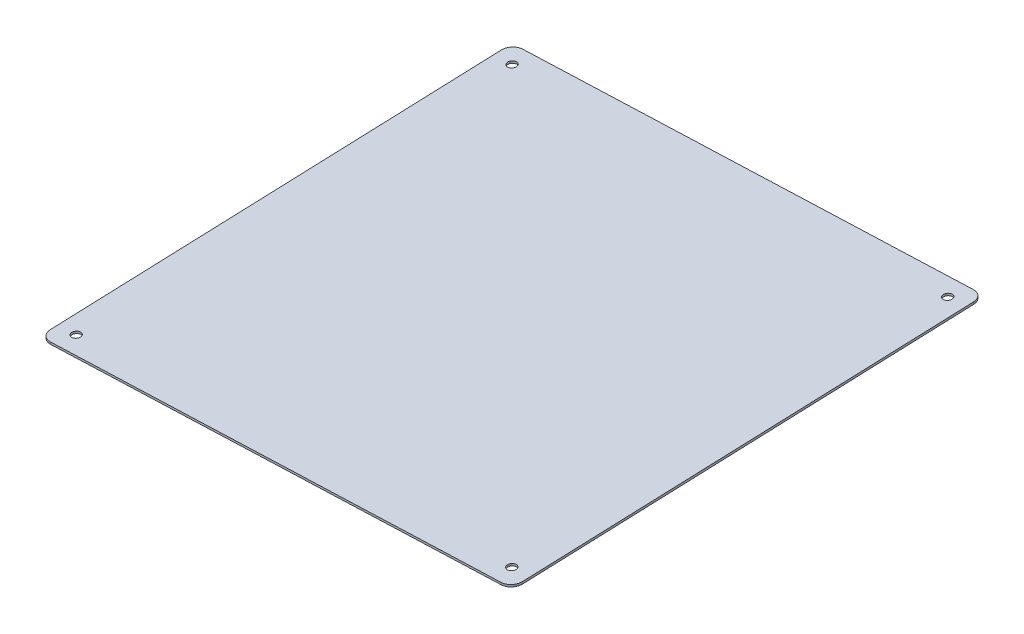
ISO-10303-21;
HEADER;
FILE_DESCRIPTION(('STEP AP214'),'2;1');
FILE_NAME('part.step','',(''),(''),'','','');
FILE_SCHEMA(('AUTOMOTIVE_DESIGN { 1 0 10303 214 1 1 1 1 }'));
ENDSEC;
DATA;
#1=APPLICATION_CONTEXT('core data for automotive mechanical design processes');
#2=APPLICATION_PROTOCOL_DEFINITION('international standard','automotive_design',2000,#1);
#3=PRODUCT_CONTEXT('',#1,'mechanical');
#4=PRODUCT('Part','Part','',(#3));
#5=PRODUCT_RELATED_PRODUCT_CATEGORY('part','',(#4));
#6=PRODUCT_DEFINITION_FORMATION('','',#4);
#7=PRODUCT_DEFINITION_CONTEXT('part definition',#1,'design');
#8=PRODUCT_DEFINITION('design','',#6,#7);
#9=PRODUCT_DEFINITION_SHAPE('','',#8);
#10=(LENGTH_UNIT() NAMED_UNIT(*) SI_UNIT(.MILLI.,.METRE.));
#11=(NAMED_UNIT(*) PLANE_ANGLE_UNIT() SI_UNIT($,.RADIAN.));
#12=(NAMED_UNIT(*) SI_UNIT($,.STERADIAN.) SOLID_ANGLE_UNIT());
#13=UNCERTAINTY_MEASURE_WITH_UNIT(LENGTH_MEASURE(1.E-05),#10,'distance_accuracy_value','');
#14=(GEOMETRIC_REPRESENTATION_CONTEXT(3) GLOBAL_UNCERTAINTY_ASSIGNED_CONTEXT((#13)) GLOBAL_UNIT_ASSIGNED_CONTEXT((#10,
#11,#12)) REPRESENTATION_CONTEXT('',''));
#15=CARTESIAN_POINT('',(0.,0.,0.));
#16=DIRECTION('',(0.,0.,1.));
#17=DIRECTION('',(1.,0.,0.));
#18=AXIS2_PLACEMENT_3D('',#15,#16,#17);
#19=CARTESIAN_POINT('',(-413.395776572268,-1960.72041790341,-116.489484106722));
#20=DIRECTION('',(-0.000699581715961789,0.0362187287763312,-0.999343641732537));
#21=DIRECTION('',(0.,0.9993438862793,0.0362187376393214));
#22=AXIS2_PLACEMENT_3D('',#19,#20,#21);
#23=PLANE('',#22);
#24=DIRECTION('',(0.999254348422852,0.0386038565877098,0.000699581715961747));
#25=VECTOR('',#24,1.);
#26=CARTESIAN_POINT('',(-413.318568859092,-1962.71761388372,-116.561921564274));
#27=LINE('',#26,#25);
#28=CARTESIAN_POINT('',(-413.318568859092,-1962.71761388372,-116.561921564274));
#29=VERTEX_POINT('',#28);
#30=CARTESIAN_POINT('',(6.3682574785056,-1946.50399411688,-116.268097243571));
#31=VERTEX_POINT('',#30);
#32=EDGE_CURVE('E172',#29,#31,#27,.T.);
#33=ORIENTED_EDGE('',*,*,#32,.T.);
#34=DIRECTION('',(0.0386038565877099,-0.998597990155389,-0.0362187287763312));
#35=VECTOR('',#34,1.);
#36=CARTESIAN_POINT('',(6.29104976533018,-1944.50679813657,-116.195659786018));
#37=LINE('',#36,#35);
#38=CARTESIAN_POINT('',(6.29104976533018,-1944.50679813657,-116.195659786018));
#39=VERTEX_POINT('',#38);
#40=EDGE_CURVE('E12',#39,#31,#37,.T.);
#41=ORIENTED_EDGE('',*,*,#40,.F.);
#42=DIRECTION('',(0.999254348422852,0.0386038565877098,0.000699581715961747));
#43=VECTOR('',#42,1.);
#44=CARTESIAN_POINT('',(-413.395776572268,-1960.72041790341,-116.489484106722));
#45=LINE('',#44,#43);
#46=CARTESIAN_POINT('',(-413.395776572268,-1960.72041790341,-116.489484106722));
#47=VERTEX_POINT('',#46);
#48=EDGE_CURVE('E164',#47,#39,#45,.T.);
#49=ORIENTED_EDGE('',*,*,#48,.F.);
#50=DIRECTION('',(0.0386038565877099,-0.998597990155389,-0.0362187287763312));
#51=VECTOR('',#50,1.);
#52=CARTESIAN_POINT('',(-413.395776572268,-1960.72041790341,-116.489484106722));
#53=LINE('',#52,#51);
#54=EDGE_CURVE('E55',#47,#29,#53,.T.);
#55=ORIENTED_EDGE('',*,*,#54,.T.);
#56=EDGE_LOOP('',(#33,#41,#49,#55));
#57=FACE_BOUND('',#56,.T.);
#58=ADVANCED_FACE('F37',(#57),#23,.F.);
#59=CARTESIAN_POINT('',(6.28405394817063,-1944.1446108488,-126.189096203343));
#60=DIRECTION('',(0.0386038565877099,-0.998597990155389,-0.0362187287763312));
#61=DIRECTION('',(0.999253613840912,0.0386292017245727,0.));
#62=AXIS2_PLACEMENT_3D('',#59,#60,#61);
#63=CYLINDRICAL_SURFACE('',#62,10.);
#64=CARTESIAN_POINT('',(6.36126166134605,-1946.14180682911,-126.261533660896));
#65=DIRECTION('',(-0.0386038565877099,0.998597990155389,0.0362187287763312));
#66=DIRECTION('',(-0.999253613840912,-0.0386292017245728,0.));
#67=AXIS2_PLACEMENT_3D('',#64,#65,#66);
#68=CIRCLE('',#67,10.);
#69=CARTESIAN_POINT('',(16.3538051455746,-1945.75576826324,-126.254537843736));
#70=VERTEX_POINT('',#69);
#71=EDGE_CURVE('E217',#31,#70,#68,.T.);
#72=ORIENTED_EDGE('',*,*,#71,.T.);
#73=DIRECTION('',(0.0386038565877099,-0.998597990155389,-0.0362187287763312));
#74=VECTOR('',#73,1.);
#75=CARTESIAN_POINT('',(16.2765974323991,-1943.75857228293,-126.182100386184));
#76=LINE('',#75,#74);
#77=CARTESIAN_POINT('',(16.2765974323991,-1943.75857228293,-126.182100386184));
#78=VERTEX_POINT('',#77);
#79=EDGE_CURVE('E46',#78,#70,#76,.T.);
#80=ORIENTED_EDGE('',*,*,#79,.F.);
#81=CARTESIAN_POINT('',(6.28405394817063,-1944.1446108488,-126.189096203343));
#82=DIRECTION('',(-0.0386038565877099,0.998597990155389,0.0362187287763312));
#83=DIRECTION('',(-0.999253613840912,-0.0386292017245728,0.));
#84=AXIS2_PLACEMENT_3D('',#81,#82,#83);
#85=CIRCLE('',#84,10.);
#86=EDGE_CURVE('E93',#39,#78,#85,.T.);
#87=ORIENTED_EDGE('',*,*,#86,.F.);
#88=ORIENTED_EDGE('',*,*,#40,.T.);
#89=EDGE_LOOP('',(#72,#80,#87,#88));
#90=FACE_BOUND('',#89,.T.);
#91=ADVANCED_FACE('F209',(#90),#63,.T.);
#92=CARTESIAN_POINT('',(16.2765974323991,-1943.75857228293,-126.182100386184));
#93=DIRECTION('',(-0.999254348422852,-0.0386038565877099,-0.00069958171596173));
#94=DIRECTION('',(0.0386038660343585,-0.999254592947764,0.));
#95=AXIS2_PLACEMENT_3D('',#92,#93,#94);
#96=PLANE('',#95);
#97=DIRECTION('',(-0.000699581715961797,0.0362187287763309,-0.999343641732537));
#98=VECTOR('',#97,1.);
#99=CARTESIAN_POINT('',(16.3538051455746,-1945.75576826324,-126.254537843736));
#100=LINE('',#99,#98);
#101=CARTESIAN_POINT('',(16.0599808248706,-1930.54390217718,-545.978867371402));
#102=VERTEX_POINT('',#101);
#103=EDGE_CURVE('E218',#70,#102,#100,.T.);
#104=ORIENTED_EDGE('',*,*,#103,.T.);
#105=DIRECTION('',(0.0386038565877099,-0.998597990155389,-0.0362187287763312));
#106=VECTOR('',#105,1.);
#107=CARTESIAN_POINT('',(15.9827731116952,-1928.54670619687,-545.906429913849));
#108=LINE('',#107,#106);
#109=CARTESIAN_POINT('',(15.9827731116952,-1928.54670619687,-545.906429913849));
#110=VERTEX_POINT('',#109);
#111=EDGE_CURVE('E238',#110,#102,#108,.T.);
#112=ORIENTED_EDGE('',*,*,#111,.F.);
#113=DIRECTION('',(-0.000699581715961797,0.0362187287763309,-0.999343641732537));
#114=VECTOR('',#113,1.);
#115=CARTESIAN_POINT('',(16.2765974323991,-1943.75857228293,-126.182100386184));
#116=LINE('',#115,#114);
#117=EDGE_CURVE('E153',#78,#110,#116,.T.);
#118=ORIENTED_EDGE('',*,*,#117,.F.);
#119=ORIENTED_EDGE('',*,*,#79,.T.);
#120=EDGE_LOOP('',(#104,#112,#118,#119));
#121=FACE_BOUND('',#120,.T.);
#122=ADVANCED_FACE('F213',(#121),#96,.F.);
#123=CARTESIAN_POINT('',(5.99022962746667,-1928.93274476274,-545.913425731009));
#124=DIRECTION('',(0.0386038565877099,-0.998597990155389,-0.0362187287763312));
#125=DIRECTION('',(0.999253613840912,0.0386292017245727,0.));
#126=AXIS2_PLACEMENT_3D('',#123,#124,#125);
#127=CYLINDRICAL_SURFACE('',#126,10.);
#128=CARTESIAN_POINT('',(6.06743734064209,-1930.92994074306,-545.985863188562));
#129=DIRECTION('',(0.0386038565877099,-0.998597990155389,-0.0362187287763312));
#130=DIRECTION('',(0.999253613840912,0.0386292017245728,0.));
#131=AXIS2_PLACEMENT_3D('',#128,#129,#130);
#132=CIRCLE('',#131,10.);
#133=CARTESIAN_POINT('',(6.06044152348241,-1930.56775345529,-555.979299605887));
#134=VERTEX_POINT('',#133);
#135=EDGE_CURVE('E223',#134,#102,#132,.T.);
#136=ORIENTED_EDGE('',*,*,#135,.F.);
#137=DIRECTION('',(0.0386038565877099,-0.998597990155389,-0.0362187287763312));
#138=VECTOR('',#137,1.);
#139=CARTESIAN_POINT('',(5.98323381030699,-1928.57055747498,-555.906862148334));
#140=LINE('',#139,#138);
#141=CARTESIAN_POINT('',(5.98323381030699,-1928.57055747498,-555.906862148334));
#142=VERTEX_POINT('',#141);
#143=EDGE_CURVE('E236',#142,#134,#140,.T.);
#144=ORIENTED_EDGE('',*,*,#143,.F.);
#145=CARTESIAN_POINT('',(5.99022962746667,-1928.93274476274,-545.913425731009));
#146=DIRECTION('',(0.0386038565877099,-0.998597990155389,-0.0362187287763312));
#147=DIRECTION('',(0.999253613840912,0.0386292017245728,0.));
#148=AXIS2_PLACEMENT_3D('',#145,#146,#147);
#149=CIRCLE('',#148,10.);
#150=EDGE_CURVE('E148',#142,#110,#149,.T.);
#151=ORIENTED_EDGE('',*,*,#150,.T.);
#152=ORIENTED_EDGE('',*,*,#111,.T.);
#153=EDGE_LOOP('',(#136,#144,#151,#152));
#154=FACE_BOUND('',#153,.T.);
#155=ADVANCED_FACE('F274',(#154),#127,.T.);
#156=CARTESIAN_POINT('',(-413.703592527291,-1944.78417724182,-556.200686469038));
#157=DIRECTION('',(-0.000699581715961854,0.0362187287763312,-0.999343641732537));
#158=DIRECTION('',(0.,0.9993438862793,0.0362187376393214));
#159=AXIS2_PLACEMENT_3D('',#156,#157,#158);
#160=PLANE('',#159);
#161=DIRECTION('',(0.999254348422852,0.0386038565877098,0.000699581715961681));
#162=VECTOR('',#161,1.);
#163=CARTESIAN_POINT('',(-413.626384814115,-1946.78137322213,-556.273123926591));
#164=LINE('',#163,#162);
#165=CARTESIAN_POINT('',(-413.626384814115,-1946.78137322213,-556.273123926591));
#166=VERTEX_POINT('',#165);
#167=EDGE_CURVE('E226',#166,#134,#164,.T.);
#168=ORIENTED_EDGE('',*,*,#167,.F.);
#169=DIRECTION('',(0.0386038565877099,-0.998597990155389,-0.0362187287763312));
#170=VECTOR('',#169,1.);
#171=CARTESIAN_POINT('',(-413.703592527291,-1944.78417724182,-556.200686469038));
#172=LINE('',#171,#170);
#173=CARTESIAN_POINT('',(-413.703592527291,-1944.78417724182,-556.200686469038));
#174=VERTEX_POINT('',#173);
#175=EDGE_CURVE('E118',#174,#166,#172,.T.);
#176=ORIENTED_EDGE('',*,*,#175,.F.);
#177=DIRECTION('',(0.999254348422852,0.0386038565877098,0.000699581715961681));
#178=VECTOR('',#177,1.);
#179=CARTESIAN_POINT('',(-413.703592527291,-1944.78417724182,-556.200686469038));
#180=LINE('',#179,#178);
#181=EDGE_CURVE('E128',#174,#142,#180,.T.);
#182=ORIENTED_EDGE('',*,*,#181,.T.);
#183=ORIENTED_EDGE('',*,*,#143,.T.);
#184=EDGE_LOOP('',(#168,#176,#182,#183));
#185=FACE_BOUND('',#184,.T.);
#186=ADVANCED_FACE('F271',(#185),#160,.T.);
#187=CARTESIAN_POINT('',(-413.696596710131,-1945.14636452958,-546.207250051713));
#188=DIRECTION('',(0.0386038565877099,-0.998597990155389,-0.0362187287763312));
#189=DIRECTION('',(0.999253613840912,0.0386292017245727,0.));
#190=AXIS2_PLACEMENT_3D('',#187,#188,#189);
#191=CYLINDRICAL_SURFACE('',#190,10.);
#192=CARTESIAN_POINT('',(-413.619388996956,-1947.14356050989,-546.279687509266));
#193=DIRECTION('',(0.0386038565877099,-0.998597990155389,-0.0362187287763312));
#194=DIRECTION('',(0.999253613840912,0.0386292017245728,0.));
#195=AXIS2_PLACEMENT_3D('',#192,#193,#194);
#196=CIRCLE('',#195,10.);
#197=CARTESIAN_POINT('',(-423.611932481184,-1947.52959907577,-546.286683326425));
#198=VERTEX_POINT('',#197);
#199=EDGE_CURVE('E114',#198,#166,#196,.T.);
#200=ORIENTED_EDGE('',*,*,#199,.F.);
#201=DIRECTION('',(0.0386038565877099,-0.998597990155389,-0.0362187287763312));
#202=VECTOR('',#201,1.);
#203=CARTESIAN_POINT('',(-423.68914019436,-1945.53240309546,-546.214245868872));
#204=LINE('',#203,#202);
#205=CARTESIAN_POINT('',(-423.68914019436,-1945.53240309546,-546.214245868872));
#206=VERTEX_POINT('',#205);
#207=EDGE_CURVE('E109',#206,#198,#204,.T.);
#208=ORIENTED_EDGE('',*,*,#207,.F.);
#209=CARTESIAN_POINT('',(-413.696596710131,-1945.14636452958,-546.207250051713));
#210=DIRECTION('',(0.0386038565877099,-0.998597990155389,-0.0362187287763312));
#211=DIRECTION('',(0.999253613840912,0.0386292017245728,0.));
#212=AXIS2_PLACEMENT_3D('',#209,#210,#211);
#213=CIRCLE('',#212,10.);
#214=EDGE_CURVE('E112',#206,#174,#213,.T.);
#215=ORIENTED_EDGE('',*,*,#214,.T.);
#216=ORIENTED_EDGE('',*,*,#175,.T.);
#217=EDGE_LOOP('',(#200,#208,#215,#216));
#218=FACE_BOUND('',#217,.T.);
#219=ADVANCED_FACE('F111',(#218),#191,.T.);
#220=CARTESIAN_POINT('',(-423.395315873656,-1960.74426918152,-126.489916341207));
#221=DIRECTION('',(-0.999254348422852,-0.0386038565877099,-0.000699581715961998));
#222=DIRECTION('',(0.0386038660343585,-0.999254592947764,0.));
#223=AXIS2_PLACEMENT_3D('',#220,#221,#222);
#224=PLANE('',#223);
#225=DIRECTION('',(-0.000699581715961549,0.0362187287763314,-0.999343641732537));
#226=VECTOR('',#225,1.);
#227=CARTESIAN_POINT('',(-423.31810816048,-1962.74146516183,-126.56235379876));
#228=LINE('',#227,#226);
#229=CARTESIAN_POINT('',(-423.31810816048,-1962.74146516183,-126.56235379876));
#230=VERTEX_POINT('',#229);
#231=EDGE_CURVE('E230',#230,#198,#228,.T.);
#232=ORIENTED_EDGE('',*,*,#231,.F.);
#233=DIRECTION('',(0.0386038565877099,-0.998597990155389,-0.0362187287763312));
#234=VECTOR('',#233,1.);
#235=CARTESIAN_POINT('',(-423.395315873656,-1960.74426918152,-126.489916341207));
#236=LINE('',#235,#234);
#237=CARTESIAN_POINT('',(-423.395315873656,-1960.74426918152,-126.489916341207));
#238=VERTEX_POINT('',#237);
#239=EDGE_CURVE('E81',#238,#230,#236,.T.);
#240=ORIENTED_EDGE('',*,*,#239,.F.);
#241=DIRECTION('',(-0.000699581715961549,0.0362187287763314,-0.999343641732537));
#242=VECTOR('',#241,1.);
#243=CARTESIAN_POINT('',(-423.395315873656,-1960.74426918152,-126.489916341207));
#244=LINE('',#243,#242);
#245=EDGE_CURVE('E125',#238,#206,#244,.T.);
#246=ORIENTED_EDGE('',*,*,#245,.T.);
#247=ORIENTED_EDGE('',*,*,#207,.T.);
#248=EDGE_LOOP('',(#232,#240,#246,#247));
#249=FACE_BOUND('',#248,.T.);
#250=ADVANCED_FACE('F131',(#249),#224,.T.);
#251=CARTESIAN_POINT('',(-413.402772389427,-1960.35823061564,-126.482920524047));
#252=DIRECTION('',(0.0386038565877099,-0.998597990155389,-0.0362187287763312));
#253=DIRECTION('',(0.999253613840912,0.0386292017245727,0.));
#254=AXIS2_PLACEMENT_3D('',#251,#252,#253);
#255=CYLINDRICAL_SURFACE('',#254,9.99999999999999);
#256=CARTESIAN_POINT('',(-413.325564676252,-1962.35542659595,-126.5553579816));
#257=DIRECTION('',(0.0386038565877099,-0.998597990155389,-0.0362187287763312));
#258=DIRECTION('',(0.999253613840912,0.0386292017245728,0.));
#259=AXIS2_PLACEMENT_3D('',#256,#257,#258);
#260=CIRCLE('',#259,9.99999999999999);
#261=EDGE_CURVE('E168',#29,#230,#260,.T.);
#262=ORIENTED_EDGE('',*,*,#261,.F.);
#263=ORIENTED_EDGE('',*,*,#54,.F.);
#264=CARTESIAN_POINT('',(-413.402772389427,-1960.35823061564,-126.482920524047));
#265=DIRECTION('',(0.0386038565877099,-0.998597990155389,-0.0362187287763312));
#266=DIRECTION('',(0.999253613840912,0.0386292017245728,0.));
#267=AXIS2_PLACEMENT_3D('',#264,#265,#266);
#268=CIRCLE('',#267,9.99999999999999);
#269=EDGE_CURVE('E133',#47,#238,#268,.T.);
#270=ORIENTED_EDGE('',*,*,#269,.T.);
#271=ORIENTED_EDGE('',*,*,#239,.T.);
#272=EDGE_LOOP('',(#262,#263,#270,#271));
#273=FACE_BOUND('',#272,.T.);
#274=ADVANCED_FACE('F261',(#273),#255,.T.);
#275=CARTESIAN_POINT('',(6.28405394817063,-1944.1446108488,-126.189096203343));
#276=DIRECTION('',(-0.0386038565877099,0.998597990155389,0.0362187287763312));
#277=DIRECTION('',(-0.999253613840912,-0.0386292017245728,0.));
#278=AXIS2_PLACEMENT_3D('',#275,#276,#277);
#279=PLANE('',#278);
#280=CARTESIAN_POINT('',(-1.0286140720127,-1929.45504576853,-538.993958717238));
#281=DIRECTION('',(-0.0386038565877099,0.998597990155389,0.0362187287763312));
#282=DIRECTION('',(-0.999253613840912,-0.0386292017245728,0.));
#283=AXIS2_PLACEMENT_3D('',#280,#281,#282);
#284=CIRCLE('',#283,4.09999999999745);
#285=CARTESIAN_POINT('',(-5.12555388875789,-1929.6134254956,-538.993958717238));
#286=VERTEX_POINT('',#285);
#287=EDGE_CURVE('E185',#286,#286,#284,.T.);
#288=ORIENTED_EDGE('',*,*,#287,.F.);
#289=EDGE_LOOP('',(#288));
#290=FACE_BOUND('',#289,.T.);
#291=CARTESIAN_POINT('',(-406.668058302112,-1945.12597775506,-539.277948413059));
#292=DIRECTION('',(-0.0386038565877099,0.998597990155389,0.0362187287763312));
#293=DIRECTION('',(-0.999253613840912,-0.0386292017245728,0.));
#294=AXIS2_PLACEMENT_3D('',#291,#292,#293);
#295=CIRCLE('',#294,4.09999999999745);
#296=CARTESIAN_POINT('',(-410.764998118857,-1945.28435748213,-539.277948413059));
#297=VERTEX_POINT('',#296);
#298=EDGE_CURVE('E180',#297,#297,#295,.F.);
#299=ORIENTED_EDGE('',*,*,#298,.T.);
#300=EDGE_LOOP('',(#299));
#301=FACE_BOUND('',#300,.T.);
#302=CARTESIAN_POINT('',(-406.383928689948,-1959.83592960986,-133.402387537819));
#303=DIRECTION('',(-0.0386038565877099,0.998597990155389,0.0362187287763312));
#304=DIRECTION('',(-0.999253613840912,-0.0386292017245728,0.));
#305=AXIS2_PLACEMENT_3D('',#302,#303,#304);
#306=CIRCLE('',#305,4.09999999999745);
#307=CARTESIAN_POINT('',(-410.480868506693,-1959.99430933693,-133.402387537819));
#308=VERTEX_POINT('',#307);
#309=EDGE_CURVE('E174',#308,#308,#306,.T.);
#310=ORIENTED_EDGE('',*,*,#309,.F.);
#311=EDGE_LOOP('',(#310));
#312=FACE_BOUND('',#311,.T.);
#313=CARTESIAN_POINT('',(-0.74448445984865,-1944.16499762333,-133.118397841998));
#314=DIRECTION('',(-0.0386038565877099,0.998597990155389,0.0362187287763312));
#315=DIRECTION('',(-0.999253613840912,-0.0386292017245728,0.));
#316=AXIS2_PLACEMENT_3D('',#313,#314,#315);
#317=CIRCLE('',#316,4.09999999999745);
#318=CARTESIAN_POINT('',(-4.84142427659384,-1944.3233773504,-133.118397841998));
#319=VERTEX_POINT('',#318);
#320=EDGE_CURVE('E169',#319,#319,#317,.F.);
#321=ORIENTED_EDGE('',*,*,#320,.T.);
#322=EDGE_LOOP('',(#321));
#323=FACE_BOUND('',#322,.T.);
#324=ORIENTED_EDGE('',*,*,#48,.T.);
#325=ORIENTED_EDGE('',*,*,#86,.T.);
#326=ORIENTED_EDGE('',*,*,#117,.T.);
#327=ORIENTED_EDGE('',*,*,#150,.F.);
#328=ORIENTED_EDGE('',*,*,#181,.F.);
#329=ORIENTED_EDGE('',*,*,#214,.F.);
#330=ORIENTED_EDGE('',*,*,#245,.F.);
#331=ORIENTED_EDGE('',*,*,#269,.F.);
#332=EDGE_LOOP('',(#324,#325,#326,#327,#328,#329,#330,#331));
#333=FACE_BOUND('',#332,.T.);
#334=ADVANCED_FACE('F123',(#290,#301,#312,#323,#333),#279,.T.);
#335=CARTESIAN_POINT('',(6.36126166134605,-1946.14180682911,-126.261533660896));
#336=DIRECTION('',(-0.0386038565877099,0.998597990155389,0.0362187287763312));
#337=DIRECTION('',(-0.999253613840912,-0.0386292017245728,0.));
#338=AXIS2_PLACEMENT_3D('',#335,#336,#337);
#339=PLANE('',#338);
#340=CARTESIAN_POINT('',(-0.95140635883727,-1931.45224174884,-539.066396174791));
#341=DIRECTION('',(-0.0386038565877099,0.998597990155389,0.0362187287763312));
#342=DIRECTION('',(-0.999253613840912,-0.0386292017245728,0.));
#343=AXIS2_PLACEMENT_3D('',#340,#341,#342);
#344=CIRCLE('',#343,4.09999999999745);
#345=CARTESIAN_POINT('',(-5.04834617558246,-1931.61062147591,-539.066396174791));
#346=VERTEX_POINT('',#345);
#347=EDGE_CURVE('E40',#346,#346,#344,.T.);
#348=ORIENTED_EDGE('',*,*,#347,.T.);
#349=EDGE_LOOP('',(#348));
#350=FACE_BOUND('',#349,.T.);
#351=CARTESIAN_POINT('',(-406.590850588937,-1947.12317373537,-539.350385870611));
#352=DIRECTION('',(-0.0386038565877099,0.998597990155389,0.0362187287763312));
#353=DIRECTION('',(-0.999253613840912,-0.0386292017245728,0.));
#354=AXIS2_PLACEMENT_3D('',#351,#352,#353);
#355=CIRCLE('',#354,4.09999999999745);
#356=CARTESIAN_POINT('',(-410.687790405682,-1947.28155346244,-539.350385870611));
#357=VERTEX_POINT('',#356);
#358=EDGE_CURVE('E184',#357,#357,#355,.F.);
#359=ORIENTED_EDGE('',*,*,#358,.F.);
#360=EDGE_LOOP('',(#359));
#361=FACE_BOUND('',#360,.T.);
#362=CARTESIAN_POINT('',(-406.306720976773,-1961.83312559017,-133.474824995371));
#363=DIRECTION('',(-0.0386038565877099,0.998597990155389,0.0362187287763312));
#364=DIRECTION('',(-0.999253613840912,-0.0386292017245728,0.));
#365=AXIS2_PLACEMENT_3D('',#362,#363,#364);
#366=CIRCLE('',#365,4.09999999999745);
#367=CARTESIAN_POINT('',(-410.403660793518,-1961.99150531724,-133.474824995371));
#368=VERTEX_POINT('',#367);
#369=EDGE_CURVE('E179',#368,#368,#366,.T.);
#370=ORIENTED_EDGE('',*,*,#369,.T.);
#371=EDGE_LOOP('',(#370));
#372=FACE_BOUND('',#371,.T.);
#373=CARTESIAN_POINT('',(-0.667276746673221,-1946.16219360364,-133.190835299551));
#374=DIRECTION('',(-0.0386038565877099,0.998597990155389,0.0362187287763312));
#375=DIRECTION('',(-0.999253613840912,-0.0386292017245728,0.));
#376=AXIS2_PLACEMENT_3D('',#373,#374,#375);
#377=CIRCLE('',#376,4.09999999999745);
#378=CARTESIAN_POINT('',(-4.76421656341841,-1946.32057333071,-133.190835299551));
#379=VERTEX_POINT('',#378);
#380=EDGE_CURVE('E173',#379,#379,#377,.F.);
#381=ORIENTED_EDGE('',*,*,#380,.F.);
#382=EDGE_LOOP('',(#381));
#383=FACE_BOUND('',#382,.T.);
#384=ORIENTED_EDGE('',*,*,#32,.F.);
#385=ORIENTED_EDGE('',*,*,#261,.T.);
#386=ORIENTED_EDGE('',*,*,#231,.T.);
#387=ORIENTED_EDGE('',*,*,#199,.T.);
#388=ORIENTED_EDGE('',*,*,#167,.T.);
#389=ORIENTED_EDGE('',*,*,#135,.T.);
#390=ORIENTED_EDGE('',*,*,#103,.F.);
#391=ORIENTED_EDGE('',*,*,#71,.F.);
#392=EDGE_LOOP('',(#384,#385,#386,#387,#388,#389,#390,#391));
#393=FACE_BOUND('',#392,.T.);
#394=ADVANCED_FACE('F195',(#350,#361,#372,#383,#393),#339,.F.);
#395=CARTESIAN_POINT('',(2.92288191598448,-2039.03180668809,-136.55917707575));
#396=DIRECTION('',(-0.0386038565877167,0.998597990155388,0.0362187287763384));
#397=DIRECTION('',(-0.999253613840911,-0.0386292017245795,0.));
#398=AXIS2_PLACEMENT_3D('',#395,#396,#397);
#399=CYLINDRICAL_SURFACE('',#398,4.09999999999745);
#400=ORIENTED_EDGE('',*,*,#320,.F.);
#401=EDGE_LOOP('',(#400));
#402=FACE_BOUND('',#401,.T.);
#403=ORIENTED_EDGE('',*,*,#380,.T.);
#404=EDGE_LOOP('',(#403));
#405=FACE_BOUND('',#404,.T.);
#406=ADVANCED_FACE('F250',(#402,#405),#399,.F.);
#407=CARTESIAN_POINT('',(-402.716562314116,-2054.70273867462,-136.843166771571));
#408=DIRECTION('',(-0.0386038565877032,0.998597990155389,0.0362187287763384));
#409=DIRECTION('',(-0.999253613840912,-0.0386292017245661,0.));
#410=AXIS2_PLACEMENT_3D('',#407,#408,#409);
#411=CYLINDRICAL_SURFACE('',#410,4.09999999999745);
#412=ORIENTED_EDGE('',*,*,#309,.T.);
#413=EDGE_LOOP('',(#412));
#414=FACE_BOUND('',#413,.T.);
#415=ORIENTED_EDGE('',*,*,#369,.F.);
#416=EDGE_LOOP('',(#415));
#417=FACE_BOUND('',#416,.T.);
#418=ADVANCED_FACE('F205',(#414,#417),#411,.F.);
#419=CARTESIAN_POINT('',(-403.00069192628,-2039.99278681982,-542.718727646809));
#420=DIRECTION('',(-0.0386038565877033,0.998597990155389,0.0362187287763241));
#421=DIRECTION('',(-0.999253613840912,-0.0386292017245661,0.));
#422=AXIS2_PLACEMENT_3D('',#419,#420,#421);
#423=CYLINDRICAL_SURFACE('',#422,4.09999999999745);
#424=ORIENTED_EDGE('',*,*,#298,.F.);
#425=EDGE_LOOP('',(#424));
#426=FACE_BOUND('',#425,.T.);
#427=ORIENTED_EDGE('',*,*,#358,.T.);
#428=EDGE_LOOP('',(#427));
#429=FACE_BOUND('',#428,.T.);
#430=ADVANCED_FACE('F200',(#426,#429),#423,.F.);
#431=CARTESIAN_POINT('',(2.63875230382044,-2024.32185483329,-542.434737950989));
#432=DIRECTION('',(-0.0386038565877167,0.998597990155389,0.0362187287763241));
#433=DIRECTION('',(-0.999253613840912,-0.0386292017245795,0.));
#434=AXIS2_PLACEMENT_3D('',#431,#432,#433);
#435=CYLINDRICAL_SURFACE('',#434,4.09999999999745);
#436=ORIENTED_EDGE('',*,*,#287,.T.);
#437=EDGE_LOOP('',(#436));
#438=FACE_BOUND('',#437,.T.);
#439=ORIENTED_EDGE('',*,*,#347,.F.);
#440=EDGE_LOOP('',(#439));
#441=FACE_BOUND('',#440,.T.);
#442=ADVANCED_FACE('F198',(#438,#441),#435,.F.);
#443=CLOSED_SHELL('',(#58,#91,#122,#155,#186,#219,#250,#274,#334,#394,#406,#418,#430,#442));
#444=MANIFOLD_SOLID_BREP('B2',#443);
#445=ADVANCED_BREP_SHAPE_REPRESENTATION('',(#18,#444),#14);
#446=SHAPE_DEFINITION_REPRESENTATION(#9,#445);
ENDSEC;
END-ISO-10303-21;
